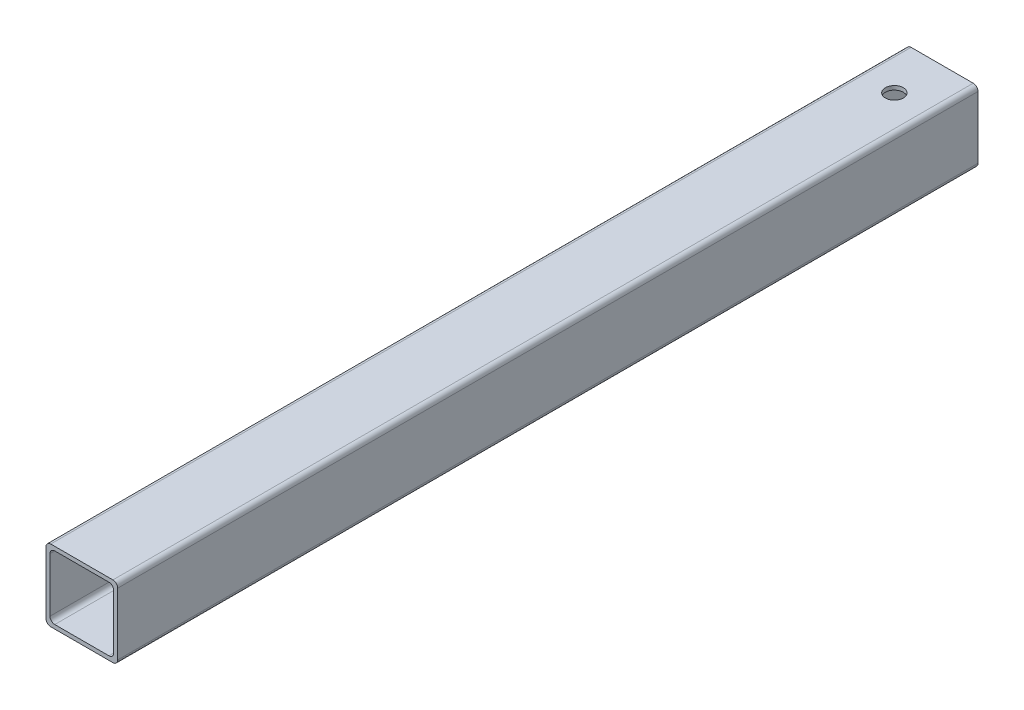
ISO-10303-21;
HEADER;
FILE_DESCRIPTION(('STEP AP214'),'2;1');
FILE_NAME('part.step','',(''),(''),'','','');
FILE_SCHEMA(('AUTOMOTIVE_DESIGN { 1 0 10303 214 1 1 1 1 }'));
ENDSEC;
DATA;
#1=APPLICATION_CONTEXT('core data for automotive mechanical design processes');
#2=APPLICATION_PROTOCOL_DEFINITION('international standard','automotive_design',2000,#1);
#3=PRODUCT_CONTEXT('',#1,'mechanical');
#4=PRODUCT('Part','Part','',(#3));
#5=PRODUCT_RELATED_PRODUCT_CATEGORY('part','',(#4));
#6=PRODUCT_DEFINITION_FORMATION('','',#4);
#7=PRODUCT_DEFINITION_CONTEXT('part definition',#1,'design');
#8=PRODUCT_DEFINITION('design','',#6,#7);
#9=PRODUCT_DEFINITION_SHAPE('','',#8);
#10=(LENGTH_UNIT() NAMED_UNIT(*) SI_UNIT(.MILLI.,.METRE.));
#11=(NAMED_UNIT(*) PLANE_ANGLE_UNIT() SI_UNIT($,.RADIAN.));
#12=(NAMED_UNIT(*) SI_UNIT($,.STERADIAN.) SOLID_ANGLE_UNIT());
#13=UNCERTAINTY_MEASURE_WITH_UNIT(LENGTH_MEASURE(1.E-05),#10,'distance_accuracy_value','');
#14=(GEOMETRIC_REPRESENTATION_CONTEXT(3) GLOBAL_UNCERTAINTY_ASSIGNED_CONTEXT((#13)) GLOBAL_UNIT_ASSIGNED_CONTEXT((#10,
#11,#12)) REPRESENTATION_CONTEXT('',''));
#15=CARTESIAN_POINT('',(0.,0.,0.));
#16=DIRECTION('',(0.,0.,1.));
#17=DIRECTION('',(1.,0.,0.));
#18=AXIS2_PLACEMENT_3D('',#15,#16,#17);
#19=CARTESIAN_POINT('',(0.,0.,457.2));
#20=DIRECTION('',(0.,0.,-1.));
#21=DIRECTION('',(-1.,0.,0.));
#22=AXIS2_PLACEMENT_3D('',#19,#20,#21);
#23=PLANE('',#22);
#24=DIRECTION('',(1.,0.,0.));
#25=VECTOR('',#24,1.);
#26=CARTESIAN_POINT('',(-19.05,-19.05,457.2));
#27=LINE('',#26,#25);
#28=CARTESIAN_POINT('',(-16.51,-19.05,457.2));
#29=VERTEX_POINT('',#28);
#30=CARTESIAN_POINT('',(16.51,-19.05,457.2));
#31=VERTEX_POINT('',#30);
#32=EDGE_CURVE('E191',#29,#31,#27,.T.);
#33=ORIENTED_EDGE('',*,*,#32,.T.);
#34=CARTESIAN_POINT('',(16.51,-16.51,457.2));
#35=DIRECTION('',(0.,0.,-1.));
#36=DIRECTION('',(-1.,0.,0.));
#37=AXIS2_PLACEMENT_3D('',#34,#35,#36);
#38=CIRCLE('',#37,2.54);
#39=CARTESIAN_POINT('',(19.05,-16.51,457.2));
#40=VERTEX_POINT('',#39);
#41=EDGE_CURVE('E212',#31,#40,#38,.F.);
#42=ORIENTED_EDGE('',*,*,#41,.T.);
#43=DIRECTION('',(0.,1.,0.));
#44=VECTOR('',#43,1.);
#45=CARTESIAN_POINT('',(19.05,-19.05,457.2));
#46=LINE('',#45,#44);
#47=CARTESIAN_POINT('',(19.05,16.51,457.2));
#48=VERTEX_POINT('',#47);
#49=EDGE_CURVE('E174',#40,#48,#46,.T.);
#50=ORIENTED_EDGE('',*,*,#49,.T.);
#51=CARTESIAN_POINT('',(16.51,16.51,457.2));
#52=DIRECTION('',(0.,0.,-1.));
#53=DIRECTION('',(-1.,0.,0.));
#54=AXIS2_PLACEMENT_3D('',#51,#52,#53);
#55=CIRCLE('',#54,2.54);
#56=CARTESIAN_POINT('',(16.51,19.05,457.2));
#57=VERTEX_POINT('',#56);
#58=EDGE_CURVE('E210',#48,#57,#55,.F.);
#59=ORIENTED_EDGE('',*,*,#58,.T.);
#60=DIRECTION('',(-1.,0.,0.));
#61=VECTOR('',#60,1.);
#62=CARTESIAN_POINT('',(-19.05,19.05,457.2));
#63=LINE('',#62,#61);
#64=CARTESIAN_POINT('',(-16.51,19.05,457.2));
#65=VERTEX_POINT('',#64);
#66=EDGE_CURVE('E290',#57,#65,#63,.T.);
#67=ORIENTED_EDGE('',*,*,#66,.T.);
#68=CARTESIAN_POINT('',(-16.51,16.51,457.2));
#69=DIRECTION('',(0.,0.,-1.));
#70=DIRECTION('',(-1.,0.,0.));
#71=AXIS2_PLACEMENT_3D('',#68,#69,#70);
#72=CIRCLE('',#71,2.54);
#73=CARTESIAN_POINT('',(-19.05,16.51,457.2));
#74=VERTEX_POINT('',#73);
#75=EDGE_CURVE('E208',#65,#74,#72,.F.);
#76=ORIENTED_EDGE('',*,*,#75,.T.);
#77=DIRECTION('',(0.,-1.,0.));
#78=VECTOR('',#77,1.);
#79=CARTESIAN_POINT('',(-19.05,-19.05,457.2));
#80=LINE('',#79,#78);
#81=CARTESIAN_POINT('',(-19.05,-16.51,457.2));
#82=VERTEX_POINT('',#81);
#83=EDGE_CURVE('E292',#74,#82,#80,.T.);
#84=ORIENTED_EDGE('',*,*,#83,.T.);
#85=CARTESIAN_POINT('',(-16.51,-16.51,457.2));
#86=DIRECTION('',(0.,0.,-1.));
#87=DIRECTION('',(-1.,0.,0.));
#88=AXIS2_PLACEMENT_3D('',#85,#86,#87);
#89=CIRCLE('',#88,2.54);
#90=EDGE_CURVE('E206',#82,#29,#89,.F.);
#91=ORIENTED_EDGE('',*,*,#90,.T.);
#92=EDGE_LOOP('',(#33,#42,#50,#59,#67,#76,#84,#91));
#93=FACE_BOUND('',#92,.T.);
#94=DIRECTION('',(0.,-1.,0.));
#95=VECTOR('',#94,1.);
#96=CARTESIAN_POINT('',(-16.9418,-16.9418,457.2));
#97=LINE('',#96,#95);
#98=CARTESIAN_POINT('',(-16.9418,14.4018,457.2));
#99=VERTEX_POINT('',#98);
#100=CARTESIAN_POINT('',(-16.9418,-14.4018,457.2));
#101=VERTEX_POINT('',#100);
#102=EDGE_CURVE('E270',#99,#101,#97,.T.);
#103=ORIENTED_EDGE('',*,*,#102,.F.);
#104=CARTESIAN_POINT('',(-14.4018,14.4018,457.2));
#105=DIRECTION('',(0.,0.,-1.));
#106=DIRECTION('',(-1.,0.,0.));
#107=AXIS2_PLACEMENT_3D('',#104,#105,#106);
#108=CIRCLE('',#107,2.54);
#109=CARTESIAN_POINT('',(-14.4018,16.9418,457.2));
#110=VERTEX_POINT('',#109);
#111=EDGE_CURVE('E252',#99,#110,#108,.T.);
#112=ORIENTED_EDGE('',*,*,#111,.T.);
#113=DIRECTION('',(-1.,0.,0.));
#114=VECTOR('',#113,1.);
#115=CARTESIAN_POINT('',(-16.9418,16.9418,457.2));
#116=LINE('',#115,#114);
#117=CARTESIAN_POINT('',(14.4018,16.9418,457.2));
#118=VERTEX_POINT('',#117);
#119=EDGE_CURVE('E182',#118,#110,#116,.T.);
#120=ORIENTED_EDGE('',*,*,#119,.F.);
#121=CARTESIAN_POINT('',(14.4018,14.4018,457.2));
#122=DIRECTION('',(0.,0.,-1.));
#123=DIRECTION('',(-1.,0.,0.));
#124=AXIS2_PLACEMENT_3D('',#121,#122,#123);
#125=CIRCLE('',#124,2.54);
#126=CARTESIAN_POINT('',(16.9418,14.4018,457.2));
#127=VERTEX_POINT('',#126);
#128=EDGE_CURVE('E248',#118,#127,#125,.T.);
#129=ORIENTED_EDGE('',*,*,#128,.T.);
#130=DIRECTION('',(0.,1.,0.));
#131=VECTOR('',#130,1.);
#132=CARTESIAN_POINT('',(16.9418,-16.9418,457.2));
#133=LINE('',#132,#131);
#134=CARTESIAN_POINT('',(16.9418,-14.4018,457.2));
#135=VERTEX_POINT('',#134);
#136=EDGE_CURVE('E188',#135,#127,#133,.T.);
#137=ORIENTED_EDGE('',*,*,#136,.F.);
#138=CARTESIAN_POINT('',(14.4018,-14.4018,457.2));
#139=DIRECTION('',(0.,0.,-1.));
#140=DIRECTION('',(-1.,0.,0.));
#141=AXIS2_PLACEMENT_3D('',#138,#139,#140);
#142=CIRCLE('',#141,2.54);
#143=CARTESIAN_POINT('',(14.4018,-16.9418,457.2));
#144=VERTEX_POINT('',#143);
#145=EDGE_CURVE('E55',#135,#144,#142,.T.);
#146=ORIENTED_EDGE('',*,*,#145,.T.);
#147=DIRECTION('',(1.,0.,0.));
#148=VECTOR('',#147,1.);
#149=CARTESIAN_POINT('',(-16.9418,-16.9418,457.2));
#150=LINE('',#149,#148);
#151=CARTESIAN_POINT('',(-14.4018,-16.9418,457.2));
#152=VERTEX_POINT('',#151);
#153=EDGE_CURVE('E272',#152,#144,#150,.T.);
#154=ORIENTED_EDGE('',*,*,#153,.F.);
#155=CARTESIAN_POINT('',(-14.4018,-14.4018,457.2));
#156=DIRECTION('',(0.,0.,-1.));
#157=DIRECTION('',(-1.,0.,0.));
#158=AXIS2_PLACEMENT_3D('',#155,#156,#157);
#159=CIRCLE('',#158,2.54);
#160=EDGE_CURVE('E11',#152,#101,#159,.T.);
#161=ORIENTED_EDGE('',*,*,#160,.T.);
#162=EDGE_LOOP('',(#103,#112,#120,#129,#137,#146,#154,#161));
#163=FACE_BOUND('',#162,.T.);
#164=ADVANCED_FACE('F39',(#93,#163),#23,.F.);
#165=CARTESIAN_POINT('',(0.,0.,0.));
#166=DIRECTION('',(0.,0.,-1.));
#167=DIRECTION('',(-1.,0.,0.));
#168=AXIS2_PLACEMENT_3D('',#165,#166,#167);
#169=PLANE('',#168);
#170=DIRECTION('',(0.,1.,0.));
#171=VECTOR('',#170,1.);
#172=CARTESIAN_POINT('',(19.05,-19.05,0.));
#173=LINE('',#172,#171);
#174=CARTESIAN_POINT('',(19.05,-16.51,0.));
#175=VERTEX_POINT('',#174);
#176=CARTESIAN_POINT('',(19.05,16.51,0.));
#177=VERTEX_POINT('',#176);
#178=EDGE_CURVE('E171',#175,#177,#173,.T.);
#179=ORIENTED_EDGE('',*,*,#178,.F.);
#180=CARTESIAN_POINT('',(16.51,-16.51,0.));
#181=DIRECTION('',(0.,0.,-1.));
#182=DIRECTION('',(-1.,0.,0.));
#183=AXIS2_PLACEMENT_3D('',#180,#181,#182);
#184=CIRCLE('',#183,2.54);
#185=CARTESIAN_POINT('',(16.51,-19.05,0.));
#186=VERTEX_POINT('',#185);
#187=EDGE_CURVE('E154',#175,#186,#184,.T.);
#188=ORIENTED_EDGE('',*,*,#187,.T.);
#189=DIRECTION('',(1.,0.,0.));
#190=VECTOR('',#189,1.);
#191=CARTESIAN_POINT('',(-19.05,-19.05,0.));
#192=LINE('',#191,#190);
#193=CARTESIAN_POINT('',(-16.51,-19.05,0.));
#194=VERTEX_POINT('',#193);
#195=EDGE_CURVE('E196',#194,#186,#192,.T.);
#196=ORIENTED_EDGE('',*,*,#195,.F.);
#197=CARTESIAN_POINT('',(-16.51,-16.51,0.));
#198=DIRECTION('',(0.,0.,-1.));
#199=DIRECTION('',(-1.,0.,0.));
#200=AXIS2_PLACEMENT_3D('',#197,#198,#199);
#201=CIRCLE('',#200,2.54);
#202=CARTESIAN_POINT('',(-19.05,-16.51,0.));
#203=VERTEX_POINT('',#202);
#204=EDGE_CURVE('E175',#194,#203,#201,.T.);
#205=ORIENTED_EDGE('',*,*,#204,.T.);
#206=DIRECTION('',(0.,-1.,0.));
#207=VECTOR('',#206,1.);
#208=CARTESIAN_POINT('',(-19.05,-19.05,0.));
#209=LINE('',#208,#207);
#210=CARTESIAN_POINT('',(-19.05,16.51,0.));
#211=VERTEX_POINT('',#210);
#212=EDGE_CURVE('E185',#211,#203,#209,.T.);
#213=ORIENTED_EDGE('',*,*,#212,.F.);
#214=CARTESIAN_POINT('',(-16.51,16.51,0.));
#215=DIRECTION('',(0.,0.,-1.));
#216=DIRECTION('',(-1.,0.,0.));
#217=AXIS2_PLACEMENT_3D('',#214,#215,#216);
#218=CIRCLE('',#217,2.54);
#219=CARTESIAN_POINT('',(-16.51,19.05,0.));
#220=VERTEX_POINT('',#219);
#221=EDGE_CURVE('E200',#211,#220,#218,.T.);
#222=ORIENTED_EDGE('',*,*,#221,.T.);
#223=DIRECTION('',(-1.,0.,0.));
#224=VECTOR('',#223,1.);
#225=CARTESIAN_POINT('',(-19.05,19.05,0.));
#226=LINE('',#225,#224);
#227=CARTESIAN_POINT('',(16.51,19.05,0.));
#228=VERTEX_POINT('',#227);
#229=EDGE_CURVE('E181',#228,#220,#226,.T.);
#230=ORIENTED_EDGE('',*,*,#229,.F.);
#231=CARTESIAN_POINT('',(16.51,16.51,0.));
#232=DIRECTION('',(0.,0.,-1.));
#233=DIRECTION('',(-1.,0.,0.));
#234=AXIS2_PLACEMENT_3D('',#231,#232,#233);
#235=CIRCLE('',#234,2.54);
#236=EDGE_CURVE('E165',#228,#177,#235,.T.);
#237=ORIENTED_EDGE('',*,*,#236,.T.);
#238=EDGE_LOOP('',(#179,#188,#196,#205,#213,#222,#230,#237));
#239=FACE_BOUND('',#238,.T.);
#240=DIRECTION('',(0.,1.,0.));
#241=VECTOR('',#240,1.);
#242=CARTESIAN_POINT('',(16.9418,-16.9418,0.));
#243=LINE('',#242,#241);
#244=CARTESIAN_POINT('',(16.9418,-14.4018,0.));
#245=VERTEX_POINT('',#244);
#246=CARTESIAN_POINT('',(16.9418,14.4018,0.));
#247=VERTEX_POINT('',#246);
#248=EDGE_CURVE('E264',#245,#247,#243,.T.);
#249=ORIENTED_EDGE('',*,*,#248,.T.);
#250=CARTESIAN_POINT('',(14.4018,14.4018,0.));
#251=DIRECTION('',(0.,0.,-1.));
#252=DIRECTION('',(-1.,0.,0.));
#253=AXIS2_PLACEMENT_3D('',#250,#251,#252);
#254=CIRCLE('',#253,2.54);
#255=CARTESIAN_POINT('',(14.4018,16.9418,0.));
#256=VERTEX_POINT('',#255);
#257=EDGE_CURVE('E246',#247,#256,#254,.F.);
#258=ORIENTED_EDGE('',*,*,#257,.T.);
#259=DIRECTION('',(-1.,0.,0.));
#260=VECTOR('',#259,1.);
#261=CARTESIAN_POINT('',(-16.9418,16.9418,0.));
#262=LINE('',#261,#260);
#263=CARTESIAN_POINT('',(-14.4018,16.9418,0.));
#264=VERTEX_POINT('',#263);
#265=EDGE_CURVE('E276',#256,#264,#262,.T.);
#266=ORIENTED_EDGE('',*,*,#265,.T.);
#267=CARTESIAN_POINT('',(-14.4018,14.4018,0.));
#268=DIRECTION('',(0.,0.,-1.));
#269=DIRECTION('',(-1.,0.,0.));
#270=AXIS2_PLACEMENT_3D('',#267,#268,#269);
#271=CIRCLE('',#270,2.54);
#272=CARTESIAN_POINT('',(-16.9418,14.4018,0.));
#273=VERTEX_POINT('',#272);
#274=EDGE_CURVE('E250',#264,#273,#271,.F.);
#275=ORIENTED_EDGE('',*,*,#274,.T.);
#276=DIRECTION('',(0.,-1.,0.));
#277=VECTOR('',#276,1.);
#278=CARTESIAN_POINT('',(-16.9418,-16.9418,0.));
#279=LINE('',#278,#277);
#280=CARTESIAN_POINT('',(-16.9418,-14.4018,0.));
#281=VERTEX_POINT('',#280);
#282=EDGE_CURVE('E259',#273,#281,#279,.T.);
#283=ORIENTED_EDGE('',*,*,#282,.T.);
#284=CARTESIAN_POINT('',(-14.4018,-14.4018,0.));
#285=DIRECTION('',(0.,0.,-1.));
#286=DIRECTION('',(-1.,0.,0.));
#287=AXIS2_PLACEMENT_3D('',#284,#285,#286);
#288=CIRCLE('',#287,2.54);
#289=CARTESIAN_POINT('',(-14.4018,-16.9418,0.));
#290=VERTEX_POINT('',#289);
#291=EDGE_CURVE('E48',#281,#290,#288,.F.);
#292=ORIENTED_EDGE('',*,*,#291,.T.);
#293=DIRECTION('',(1.,0.,0.));
#294=VECTOR('',#293,1.);
#295=CARTESIAN_POINT('',(-16.9418,-16.9418,0.));
#296=LINE('',#295,#294);
#297=CARTESIAN_POINT('',(14.4018,-16.9418,0.));
#298=VERTEX_POINT('',#297);
#299=EDGE_CURVE('E257',#290,#298,#296,.T.);
#300=ORIENTED_EDGE('',*,*,#299,.T.);
#301=CARTESIAN_POINT('',(14.4018,-14.4018,0.));
#302=DIRECTION('',(0.,0.,-1.));
#303=DIRECTION('',(-1.,0.,0.));
#304=AXIS2_PLACEMENT_3D('',#301,#302,#303);
#305=CIRCLE('',#304,2.54);
#306=EDGE_CURVE('E243',#298,#245,#305,.F.);
#307=ORIENTED_EDGE('',*,*,#306,.T.);
#308=EDGE_LOOP('',(#249,#258,#266,#275,#283,#292,#300,#307));
#309=FACE_BOUND('',#308,.T.);
#310=ADVANCED_FACE('F178',(#239,#309),#169,.T.);
#311=CARTESIAN_POINT('',(19.05,-19.05,457.2));
#312=DIRECTION('',(-1.,0.,0.));
#313=DIRECTION('',(0.,0.,1.));
#314=AXIS2_PLACEMENT_3D('',#311,#312,#313);
#315=PLANE('',#314);
#316=ORIENTED_EDGE('',*,*,#49,.F.);
#317=DIRECTION('',(0.,0.,-1.));
#318=VECTOR('',#317,1.);
#319=CARTESIAN_POINT('',(19.05,-16.51,457.2));
#320=LINE('',#319,#318);
#321=EDGE_CURVE('E158',#40,#175,#320,.T.);
#322=ORIENTED_EDGE('',*,*,#321,.T.);
#323=ORIENTED_EDGE('',*,*,#178,.T.);
#324=DIRECTION('',(0.,0.,-1.));
#325=VECTOR('',#324,1.);
#326=CARTESIAN_POINT('',(19.05,16.51,457.2));
#327=LINE('',#326,#325);
#328=EDGE_CURVE('E176',#177,#48,#327,.F.);
#329=ORIENTED_EDGE('',*,*,#328,.T.);
#330=EDGE_LOOP('',(#316,#322,#323,#329));
#331=FACE_BOUND('',#330,.T.);
#332=ADVANCED_FACE('F170',(#331),#315,.F.);
#333=CARTESIAN_POINT('',(-19.05,19.05,457.2));
#334=DIRECTION('',(0.,-1.,0.));
#335=DIRECTION('',(0.,0.,-1.));
#336=AXIS2_PLACEMENT_3D('',#333,#334,#335);
#337=PLANE('',#336);
#338=CARTESIAN_POINT('',(0.,19.05,25.4));
#339=DIRECTION('',(0.,1.,0.));
#340=DIRECTION('',(0.,0.,1.));
#341=AXIS2_PLACEMENT_3D('',#338,#339,#340);
#342=CIRCLE('',#341,4.7625);
#343=CARTESIAN_POINT('',(0.,19.05,30.1625));
#344=VERTEX_POINT('',#343);
#345=EDGE_CURVE('E392',#344,#344,#342,.T.);
#346=ORIENTED_EDGE('',*,*,#345,.F.);
#347=EDGE_LOOP('',(#346));
#348=FACE_BOUND('',#347,.T.);
#349=ORIENTED_EDGE('',*,*,#66,.F.);
#350=DIRECTION('',(0.,0.,-1.));
#351=VECTOR('',#350,1.);
#352=CARTESIAN_POINT('',(16.51,19.05,457.2));
#353=LINE('',#352,#351);
#354=EDGE_CURVE('E230',#57,#228,#353,.T.);
#355=ORIENTED_EDGE('',*,*,#354,.T.);
#356=ORIENTED_EDGE('',*,*,#229,.T.);
#357=DIRECTION('',(0.,0.,-1.));
#358=VECTOR('',#357,1.);
#359=CARTESIAN_POINT('',(-16.51,19.05,457.2));
#360=LINE('',#359,#358);
#361=EDGE_CURVE('E228',#220,#65,#360,.F.);
#362=ORIENTED_EDGE('',*,*,#361,.T.);
#363=EDGE_LOOP('',(#349,#355,#356,#362));
#364=FACE_BOUND('',#363,.T.);
#365=ADVANCED_FACE('F314',(#348,#364),#337,.F.);
#366=CARTESIAN_POINT('',(-19.05,-19.05,457.2));
#367=DIRECTION('',(1.,0.,0.));
#368=DIRECTION('',(0.,0.,-1.));
#369=AXIS2_PLACEMENT_3D('',#366,#367,#368);
#370=PLANE('',#369);
#371=ORIENTED_EDGE('',*,*,#83,.F.);
#372=DIRECTION('',(0.,0.,-1.));
#373=VECTOR('',#372,1.);
#374=CARTESIAN_POINT('',(-19.05,16.51,457.2));
#375=LINE('',#374,#373);
#376=EDGE_CURVE('E240',#74,#211,#375,.T.);
#377=ORIENTED_EDGE('',*,*,#376,.T.);
#378=ORIENTED_EDGE('',*,*,#212,.T.);
#379=DIRECTION('',(0.,0.,-1.));
#380=VECTOR('',#379,1.);
#381=CARTESIAN_POINT('',(-19.05,-16.51,457.2));
#382=LINE('',#381,#380);
#383=EDGE_CURVE('E238',#203,#82,#382,.F.);
#384=ORIENTED_EDGE('',*,*,#383,.T.);
#385=EDGE_LOOP('',(#371,#377,#378,#384));
#386=FACE_BOUND('',#385,.T.);
#387=ADVANCED_FACE('F306',(#386),#370,.F.);
#388=CARTESIAN_POINT('',(-19.05,-19.05,457.2));
#389=DIRECTION('',(0.,1.,0.));
#390=DIRECTION('',(0.,0.,1.));
#391=AXIS2_PLACEMENT_3D('',#388,#389,#390);
#392=PLANE('',#391);
#393=CARTESIAN_POINT('',(0.,-19.05,25.4));
#394=DIRECTION('',(0.,1.,0.));
#395=DIRECTION('',(0.,0.,1.));
#396=AXIS2_PLACEMENT_3D('',#393,#394,#395);
#397=CIRCLE('',#396,4.7625);
#398=CARTESIAN_POINT('',(0.,-19.05,30.1625));
#399=VERTEX_POINT('',#398);
#400=EDGE_CURVE('E389',#399,#399,#397,.T.);
#401=ORIENTED_EDGE('',*,*,#400,.T.);
#402=EDGE_LOOP('',(#401));
#403=FACE_BOUND('',#402,.T.);
#404=ORIENTED_EDGE('',*,*,#195,.T.);
#405=DIRECTION('',(0.,0.,-1.));
#406=VECTOR('',#405,1.);
#407=CARTESIAN_POINT('',(16.51,-19.05,457.2));
#408=LINE('',#407,#406);
#409=EDGE_CURVE('E159',#186,#31,#408,.F.);
#410=ORIENTED_EDGE('',*,*,#409,.T.);
#411=ORIENTED_EDGE('',*,*,#32,.F.);
#412=DIRECTION('',(0.,0.,-1.));
#413=VECTOR('',#412,1.);
#414=CARTESIAN_POINT('',(-16.51,-19.05,457.2));
#415=LINE('',#414,#413);
#416=EDGE_CURVE('E164',#29,#194,#415,.T.);
#417=ORIENTED_EDGE('',*,*,#416,.T.);
#418=EDGE_LOOP('',(#404,#410,#411,#417));
#419=FACE_BOUND('',#418,.T.);
#420=ADVANCED_FACE('F301',(#403,#419),#392,.F.);
#421=CARTESIAN_POINT('',(-16.9418,-16.9418,457.2));
#422=DIRECTION('',(1.,0.,0.));
#423=DIRECTION('',(0.,0.,-1.));
#424=AXIS2_PLACEMENT_3D('',#421,#422,#423);
#425=PLANE('',#424);
#426=ORIENTED_EDGE('',*,*,#282,.F.);
#427=DIRECTION('',(0.,0.,-1.));
#428=VECTOR('',#427,1.);
#429=CARTESIAN_POINT('',(-16.9418,14.4018,457.2));
#430=LINE('',#429,#428);
#431=EDGE_CURVE('E236',#273,#99,#430,.F.);
#432=ORIENTED_EDGE('',*,*,#431,.T.);
#433=ORIENTED_EDGE('',*,*,#102,.T.);
#434=DIRECTION('',(0.,0.,-1.));
#435=VECTOR('',#434,1.);
#436=CARTESIAN_POINT('',(-16.9418,-14.4018,0.));
#437=LINE('',#436,#435);
#438=EDGE_CURVE('E233',#101,#281,#437,.T.);
#439=ORIENTED_EDGE('',*,*,#438,.T.);
#440=EDGE_LOOP('',(#426,#432,#433,#439));
#441=FACE_BOUND('',#440,.T.);
#442=ADVANCED_FACE('F274',(#441),#425,.T.);
#443=CARTESIAN_POINT('',(-16.9418,-16.9418,457.2));
#444=DIRECTION('',(0.,1.,0.));
#445=DIRECTION('',(0.,0.,1.));
#446=AXIS2_PLACEMENT_3D('',#443,#444,#445);
#447=PLANE('',#446);
#448=CARTESIAN_POINT('',(0.,-16.9418,25.4));
#449=DIRECTION('',(0.,1.,0.));
#450=DIRECTION('',(0.,0.,1.));
#451=AXIS2_PLACEMENT_3D('',#448,#449,#450);
#452=CIRCLE('',#451,4.7625);
#453=CARTESIAN_POINT('',(0.,-16.9418,30.1625));
#454=VERTEX_POINT('',#453);
#455=EDGE_CURVE('E282',#454,#454,#452,.T.);
#456=ORIENTED_EDGE('',*,*,#455,.F.);
#457=EDGE_LOOP('',(#456));
#458=FACE_BOUND('',#457,.T.);
#459=ORIENTED_EDGE('',*,*,#153,.T.);
#460=DIRECTION('',(0.,0.,-1.));
#461=VECTOR('',#460,1.);
#462=CARTESIAN_POINT('',(14.4018,-16.9418,0.));
#463=LINE('',#462,#461);
#464=EDGE_CURVE('E215',#144,#298,#463,.T.);
#465=ORIENTED_EDGE('',*,*,#464,.T.);
#466=ORIENTED_EDGE('',*,*,#299,.F.);
#467=DIRECTION('',(0.,0.,-1.));
#468=VECTOR('',#467,1.);
#469=CARTESIAN_POINT('',(-14.4018,-16.9418,457.2));
#470=LINE('',#469,#468);
#471=EDGE_CURVE('E62',#290,#152,#470,.F.);
#472=ORIENTED_EDGE('',*,*,#471,.T.);
#473=EDGE_LOOP('',(#459,#465,#466,#472));
#474=FACE_BOUND('',#473,.T.);
#475=ADVANCED_FACE('F262',(#458,#474),#447,.T.);
#476=CARTESIAN_POINT('',(16.9418,-16.9418,457.2));
#477=DIRECTION('',(-1.,0.,0.));
#478=DIRECTION('',(0.,-1.,0.));
#479=AXIS2_PLACEMENT_3D('',#476,#477,#478);
#480=PLANE('',#479);
#481=ORIENTED_EDGE('',*,*,#248,.F.);
#482=DIRECTION('',(0.,0.,-1.));
#483=VECTOR('',#482,1.);
#484=CARTESIAN_POINT('',(16.9418,-14.4018,457.2));
#485=LINE('',#484,#483);
#486=EDGE_CURVE('E221',#245,#135,#485,.F.);
#487=ORIENTED_EDGE('',*,*,#486,.T.);
#488=ORIENTED_EDGE('',*,*,#136,.T.);
#489=DIRECTION('',(0.,0.,-1.));
#490=VECTOR('',#489,1.);
#491=CARTESIAN_POINT('',(16.9418,14.4018,0.));
#492=LINE('',#491,#490);
#493=EDGE_CURVE('E218',#127,#247,#492,.T.);
#494=ORIENTED_EDGE('',*,*,#493,.T.);
#495=EDGE_LOOP('',(#481,#487,#488,#494));
#496=FACE_BOUND('',#495,.T.);
#497=ADVANCED_FACE('F361',(#496),#480,.T.);
#498=CARTESIAN_POINT('',(-16.9418,16.9418,457.2));
#499=DIRECTION('',(0.,-1.,0.));
#500=DIRECTION('',(1.,0.,0.));
#501=AXIS2_PLACEMENT_3D('',#498,#499,#500);
#502=PLANE('',#501);
#503=CARTESIAN_POINT('',(0.,16.9418,25.4));
#504=DIRECTION('',(0.,-1.,0.));
#505=DIRECTION('',(1.,0.,0.));
#506=AXIS2_PLACEMENT_3D('',#503,#504,#505);
#507=CIRCLE('',#506,4.7625);
#508=CARTESIAN_POINT('',(0.,16.9418,30.1625));
#509=VERTEX_POINT('',#508);
#510=EDGE_CURVE('E43',#509,#509,#507,.T.);
#511=ORIENTED_EDGE('',*,*,#510,.F.);
#512=EDGE_LOOP('',(#511));
#513=FACE_BOUND('',#512,.T.);
#514=ORIENTED_EDGE('',*,*,#265,.F.);
#515=DIRECTION('',(0.,0.,-1.));
#516=VECTOR('',#515,1.);
#517=CARTESIAN_POINT('',(14.4018,16.9418,457.2));
#518=LINE('',#517,#516);
#519=EDGE_CURVE('E226',#256,#118,#518,.F.);
#520=ORIENTED_EDGE('',*,*,#519,.T.);
#521=ORIENTED_EDGE('',*,*,#119,.T.);
#522=DIRECTION('',(0.,0.,-1.));
#523=VECTOR('',#522,1.);
#524=CARTESIAN_POINT('',(-14.4018,16.9418,0.));
#525=LINE('',#524,#523);
#526=EDGE_CURVE('E223',#110,#264,#525,.T.);
#527=ORIENTED_EDGE('',*,*,#526,.T.);
#528=EDGE_LOOP('',(#514,#520,#521,#527));
#529=FACE_BOUND('',#528,.T.);
#530=ADVANCED_FACE('F353',(#513,#529),#502,.T.);
#531=CARTESIAN_POINT('',(16.51,-16.51,457.2));
#532=DIRECTION('',(0.,0.,-1.));
#533=DIRECTION('',(-1.,0.,0.));
#534=AXIS2_PLACEMENT_3D('',#531,#532,#533);
#535=CYLINDRICAL_SURFACE('',#534,2.54);
#536=ORIENTED_EDGE('',*,*,#41,.F.);
#537=ORIENTED_EDGE('',*,*,#409,.F.);
#538=ORIENTED_EDGE('',*,*,#187,.F.);
#539=ORIENTED_EDGE('',*,*,#321,.F.);
#540=EDGE_LOOP('',(#536,#537,#538,#539));
#541=FACE_BOUND('',#540,.T.);
#542=ADVANCED_FACE('F157',(#541),#535,.T.);
#543=CARTESIAN_POINT('',(14.4018,-14.4018,457.2));
#544=DIRECTION('',(0.,0.,1.));
#545=DIRECTION('',(1.,0.,0.));
#546=AXIS2_PLACEMENT_3D('',#543,#544,#545);
#547=CYLINDRICAL_SURFACE('',#546,2.54);
#548=ORIENTED_EDGE('',*,*,#145,.F.);
#549=ORIENTED_EDGE('',*,*,#486,.F.);
#550=ORIENTED_EDGE('',*,*,#306,.F.);
#551=ORIENTED_EDGE('',*,*,#464,.F.);
#552=EDGE_LOOP('',(#548,#549,#550,#551));
#553=FACE_BOUND('',#552,.T.);
#554=ADVANCED_FACE('F329',(#553),#547,.F.);
#555=CARTESIAN_POINT('',(14.4018,14.4018,457.2));
#556=DIRECTION('',(0.,0.,1.));
#557=DIRECTION('',(1.,0.,0.));
#558=AXIS2_PLACEMENT_3D('',#555,#556,#557);
#559=CYLINDRICAL_SURFACE('',#558,2.54);
#560=ORIENTED_EDGE('',*,*,#128,.F.);
#561=ORIENTED_EDGE('',*,*,#519,.F.);
#562=ORIENTED_EDGE('',*,*,#257,.F.);
#563=ORIENTED_EDGE('',*,*,#493,.F.);
#564=EDGE_LOOP('',(#560,#561,#562,#563));
#565=FACE_BOUND('',#564,.T.);
#566=ADVANCED_FACE('F321',(#565),#559,.F.);
#567=CARTESIAN_POINT('',(16.51,16.51,457.2));
#568=DIRECTION('',(0.,0.,-1.));
#569=DIRECTION('',(-1.,0.,0.));
#570=AXIS2_PLACEMENT_3D('',#567,#568,#569);
#571=CYLINDRICAL_SURFACE('',#570,2.54);
#572=ORIENTED_EDGE('',*,*,#58,.F.);
#573=ORIENTED_EDGE('',*,*,#328,.F.);
#574=ORIENTED_EDGE('',*,*,#236,.F.);
#575=ORIENTED_EDGE('',*,*,#354,.F.);
#576=EDGE_LOOP('',(#572,#573,#574,#575));
#577=FACE_BOUND('',#576,.T.);
#578=ADVANCED_FACE('F318',(#577),#571,.T.);
#579=CARTESIAN_POINT('',(-14.4018,14.4018,457.2));
#580=DIRECTION('',(0.,0.,1.));
#581=DIRECTION('',(1.,0.,0.));
#582=AXIS2_PLACEMENT_3D('',#579,#580,#581);
#583=CYLINDRICAL_SURFACE('',#582,2.54);
#584=ORIENTED_EDGE('',*,*,#111,.F.);
#585=ORIENTED_EDGE('',*,*,#431,.F.);
#586=ORIENTED_EDGE('',*,*,#274,.F.);
#587=ORIENTED_EDGE('',*,*,#526,.F.);
#588=EDGE_LOOP('',(#584,#585,#586,#587));
#589=FACE_BOUND('',#588,.T.);
#590=ADVANCED_FACE('F320',(#589),#583,.F.);
#591=CARTESIAN_POINT('',(-16.51,16.51,457.2));
#592=DIRECTION('',(0.,0.,-1.));
#593=DIRECTION('',(-1.,0.,0.));
#594=AXIS2_PLACEMENT_3D('',#591,#592,#593);
#595=CYLINDRICAL_SURFACE('',#594,2.54);
#596=ORIENTED_EDGE('',*,*,#75,.F.);
#597=ORIENTED_EDGE('',*,*,#361,.F.);
#598=ORIENTED_EDGE('',*,*,#221,.F.);
#599=ORIENTED_EDGE('',*,*,#376,.F.);
#600=EDGE_LOOP('',(#596,#597,#598,#599));
#601=FACE_BOUND('',#600,.T.);
#602=ADVANCED_FACE('F310',(#601),#595,.T.);
#603=CARTESIAN_POINT('',(-14.4018,-14.4018,457.2));
#604=DIRECTION('',(0.,0.,1.));
#605=DIRECTION('',(1.,0.,0.));
#606=AXIS2_PLACEMENT_3D('',#603,#604,#605);
#607=CYLINDRICAL_SURFACE('',#606,2.54);
#608=ORIENTED_EDGE('',*,*,#160,.F.);
#609=ORIENTED_EDGE('',*,*,#471,.F.);
#610=ORIENTED_EDGE('',*,*,#291,.F.);
#611=ORIENTED_EDGE('',*,*,#438,.F.);
#612=EDGE_LOOP('',(#608,#609,#610,#611));
#613=FACE_BOUND('',#612,.T.);
#614=ADVANCED_FACE('F267',(#613),#607,.F.);
#615=CARTESIAN_POINT('',(-16.51,-16.51,457.2));
#616=DIRECTION('',(0.,0.,-1.));
#617=DIRECTION('',(-1.,0.,0.));
#618=AXIS2_PLACEMENT_3D('',#615,#616,#617);
#619=CYLINDRICAL_SURFACE('',#618,2.54);
#620=ORIENTED_EDGE('',*,*,#90,.F.);
#621=ORIENTED_EDGE('',*,*,#383,.F.);
#622=ORIENTED_EDGE('',*,*,#204,.F.);
#623=ORIENTED_EDGE('',*,*,#416,.F.);
#624=EDGE_LOOP('',(#620,#621,#622,#623));
#625=FACE_BOUND('',#624,.T.);
#626=ADVANCED_FACE('F41',(#625),#619,.T.);
#627=CARTESIAN_POINT('',(0.,-19.05,25.4));
#628=DIRECTION('',(0.,1.,0.));
#629=DIRECTION('',(0.,0.,1.));
#630=AXIS2_PLACEMENT_3D('',#627,#628,#629);
#631=CYLINDRICAL_SURFACE('',#630,4.7625);
#632=CARTESIAN_POINT('',(0.,16.9418,30.1625));
#633=CARTESIAN_POINT('',(0.,16.9637604166667,30.1625));
#634=CARTESIAN_POINT('',(0.,16.9857208333333,30.1625));
#635=CARTESIAN_POINT('',(0.,17.0296416666667,30.1625));
#636=CARTESIAN_POINT('',(0.,17.0516020833333,30.1625));
#637=CARTESIAN_POINT('',(0.,17.0955229166667,30.1625));
#638=CARTESIAN_POINT('',(0.,17.1174833333333,30.1625));
#639=CARTESIAN_POINT('',(0.,17.1614041666667,30.1625));
#640=CARTESIAN_POINT('',(0.,17.1833645833333,30.1625));
#641=CARTESIAN_POINT('',(0.,17.2272854166667,30.1625));
#642=CARTESIAN_POINT('',(0.,17.2492458333333,30.1625));
#643=CARTESIAN_POINT('',(0.,17.2931666666667,30.1625));
#644=CARTESIAN_POINT('',(0.,17.3151270833333,30.1625));
#645=CARTESIAN_POINT('',(0.,17.3590479166667,30.1625));
#646=CARTESIAN_POINT('',(0.,17.3810083333333,30.1625));
#647=CARTESIAN_POINT('',(0.,17.4249291666667,30.1625));
#648=CARTESIAN_POINT('',(0.,17.4468895833333,30.1625));
#649=CARTESIAN_POINT('',(0.,17.4908104166667,30.1625));
#650=CARTESIAN_POINT('',(0.,17.5127708333333,30.1625));
#651=CARTESIAN_POINT('',(0.,17.5566916666667,30.1625));
#652=CARTESIAN_POINT('',(0.,17.5786520833333,30.1625));
#653=CARTESIAN_POINT('',(0.,17.6225729166667,30.1625));
#654=CARTESIAN_POINT('',(0.,17.6445333333333,30.1625));
#655=CARTESIAN_POINT('',(0.,17.6884541666667,30.1625));
#656=CARTESIAN_POINT('',(0.,17.7104145833333,30.1625));
#657=CARTESIAN_POINT('',(0.,17.7543354166667,30.1625));
#658=CARTESIAN_POINT('',(0.,17.7762958333333,30.1625));
#659=CARTESIAN_POINT('',(0.,17.8202166666667,30.1625));
#660=CARTESIAN_POINT('',(0.,17.8421770833333,30.1625));
#661=CARTESIAN_POINT('',(0.,17.8860979166667,30.1625));
#662=CARTESIAN_POINT('',(0.,17.9080583333333,30.1625));
#663=CARTESIAN_POINT('',(0.,17.9519791666667,30.1625));
#664=CARTESIAN_POINT('',(0.,17.9739395833333,30.1625));
#665=CARTESIAN_POINT('',(0.,18.0178604166667,30.1625));
#666=CARTESIAN_POINT('',(0.,18.0398208333333,30.1625));
#667=CARTESIAN_POINT('',(0.,18.0837416666667,30.1625));
#668=CARTESIAN_POINT('',(0.,18.1057020833333,30.1625));
#669=CARTESIAN_POINT('',(0.,18.1496229166667,30.1625));
#670=CARTESIAN_POINT('',(0.,18.1715833333333,30.1625));
#671=CARTESIAN_POINT('',(0.,18.2155041666667,30.1625));
#672=CARTESIAN_POINT('',(0.,18.2374645833333,30.1625));
#673=CARTESIAN_POINT('',(0.,18.2813854166667,30.1625));
#674=CARTESIAN_POINT('',(0.,18.3033458333333,30.1625));
#675=CARTESIAN_POINT('',(0.,18.3472666666667,30.1625));
#676=CARTESIAN_POINT('',(0.,18.3692270833333,30.1625));
#677=CARTESIAN_POINT('',(0.,18.4131479166667,30.1625));
#678=CARTESIAN_POINT('',(0.,18.4351083333333,30.1625));
#679=CARTESIAN_POINT('',(0.,18.4790291666667,30.1625));
#680=CARTESIAN_POINT('',(0.,18.5009895833333,30.1625));
#681=CARTESIAN_POINT('',(0.,18.5449104166667,30.1625));
#682=CARTESIAN_POINT('',(0.,18.5668708333333,30.1625));
#683=CARTESIAN_POINT('',(0.,18.6107916666667,30.1625));
#684=CARTESIAN_POINT('',(0.,18.6327520833333,30.1625));
#685=CARTESIAN_POINT('',(0.,18.6766729166667,30.1625));
#686=CARTESIAN_POINT('',(0.,18.6986333333333,30.1625));
#687=CARTESIAN_POINT('',(0.,18.7425541666667,30.1625));
#688=CARTESIAN_POINT('',(0.,18.7645145833333,30.1625));
#689=CARTESIAN_POINT('',(0.,18.8084354166667,30.1625));
#690=CARTESIAN_POINT('',(0.,18.8303958333333,30.1625));
#691=CARTESIAN_POINT('',(0.,18.8743166666667,30.1625));
#692=CARTESIAN_POINT('',(0.,18.8962770833333,30.1625));
#693=CARTESIAN_POINT('',(0.,18.9401979166667,30.1625));
#694=CARTESIAN_POINT('',(0.,18.9621583333333,30.1625));
#695=CARTESIAN_POINT('',(0.,19.0060791666667,30.1625));
#696=CARTESIAN_POINT('',(0.,19.0280395833333,30.1625));
#697=CARTESIAN_POINT('',(0.,19.05,30.1625));
#698=B_SPLINE_CURVE_WITH_KNOTS('',3,(#632,#633,#634,#635,#636,#637,#638,#639,#640,#641,#642,
#643,#644,#645,#646,#647,#648,#649,#650,#651,#652,#653,#654,#655,#656,#657,#658,#659,#660,#661,
#662,#663,#664,#665,#666,#667,#668,#669,#670,#671,#672,#673,#674,#675,#676,#677,#678,#679,#680,
#681,#682,#683,#684,#685,#686,#687,#688,#689,#690,#691,#692,#693,#694,#695,#696,#697),
.UNSPECIFIED.,.F.,.F.,(4,2,2,2,2,2,2,2,2,2,2,2,2,2,2,2,2,2,2,2,2,2,2,2,2,2,2,2,2,2,2,2,4),(0.,
0.0658812499999967,0.1317625,0.197643749999997,0.263525000000001,0.329406249999997,
0.395287500000001,0.461168749999998,0.527050000000001,0.592931249999998,0.658812499999994,
0.724693749999998,0.790574999999995,0.856456249999998,0.922337499999995,0.988218749999999,
1.0541,1.11998124999999,1.1858625,1.25174374999999,1.317625,1.38350624999999,1.4493875,
1.51526874999999,1.58114999999999,1.64703124999999,1.71291249999999,1.77879374999999,
1.84467499999999,1.91055624999999,1.97643749999999,2.04231874999999,2.10819999999999),.UNSPECIFIED.);
#699=EDGE_CURVE('BSEAM380',#509,#344,#698,.T.);
#700=ORIENTED_EDGE('',*,*,#510,.T.);
#701=ORIENTED_EDGE('',*,*,#345,.T.);
#702=ORIENTED_EDGE('',*,*,#699,.T.);
#703=ORIENTED_EDGE('',*,*,#699,.F.);
#704=EDGE_LOOP('',(#700,#702,#701,#703));
#705=FACE_BOUND('',#704,.T.);
#706=ADVANCED_FACE('F380',(#705),#631,.F.);
#707=CARTESIAN_POINT('',(0.,-16.9418,30.1625));
#708=CARTESIAN_POINT('',(0.,-16.9637604166667,30.1625));
#709=CARTESIAN_POINT('',(0.,-16.9857208333333,30.1625));
#710=CARTESIAN_POINT('',(0.,-17.0296416666667,30.1625));
#711=CARTESIAN_POINT('',(0.,-17.0516020833333,30.1625));
#712=CARTESIAN_POINT('',(0.,-17.0955229166667,30.1625));
#713=CARTESIAN_POINT('',(0.,-17.1174833333333,30.1625));
#714=CARTESIAN_POINT('',(0.,-17.1614041666667,30.1625));
#715=CARTESIAN_POINT('',(0.,-17.1833645833333,30.1625));
#716=CARTESIAN_POINT('',(0.,-17.2272854166667,30.1625));
#717=CARTESIAN_POINT('',(0.,-17.2492458333333,30.1625));
#718=CARTESIAN_POINT('',(0.,-17.2931666666667,30.1625));
#719=CARTESIAN_POINT('',(0.,-17.3151270833333,30.1625));
#720=CARTESIAN_POINT('',(0.,-17.3590479166667,30.1625));
#721=CARTESIAN_POINT('',(0.,-17.3810083333333,30.1625));
#722=CARTESIAN_POINT('',(0.,-17.4249291666667,30.1625));
#723=CARTESIAN_POINT('',(0.,-17.4468895833333,30.1625));
#724=CARTESIAN_POINT('',(0.,-17.4908104166667,30.1625));
#725=CARTESIAN_POINT('',(0.,-17.5127708333333,30.1625));
#726=CARTESIAN_POINT('',(0.,-17.5566916666667,30.1625));
#727=CARTESIAN_POINT('',(0.,-17.5786520833333,30.1625));
#728=CARTESIAN_POINT('',(0.,-17.6225729166667,30.1625));
#729=CARTESIAN_POINT('',(0.,-17.6445333333333,30.1625));
#730=CARTESIAN_POINT('',(0.,-17.6884541666667,30.1625));
#731=CARTESIAN_POINT('',(0.,-17.7104145833333,30.1625));
#732=CARTESIAN_POINT('',(0.,-17.7543354166667,30.1625));
#733=CARTESIAN_POINT('',(0.,-17.7762958333333,30.1625));
#734=CARTESIAN_POINT('',(0.,-17.8202166666667,30.1625));
#735=CARTESIAN_POINT('',(0.,-17.8421770833333,30.1625));
#736=CARTESIAN_POINT('',(0.,-17.8860979166667,30.1625));
#737=CARTESIAN_POINT('',(0.,-17.9080583333333,30.1625));
#738=CARTESIAN_POINT('',(0.,-17.9519791666667,30.1625));
#739=CARTESIAN_POINT('',(0.,-17.9739395833333,30.1625));
#740=CARTESIAN_POINT('',(0.,-18.0178604166667,30.1625));
#741=CARTESIAN_POINT('',(0.,-18.0398208333333,30.1625));
#742=CARTESIAN_POINT('',(0.,-18.0837416666667,30.1625));
#743=CARTESIAN_POINT('',(0.,-18.1057020833333,30.1625));
#744=CARTESIAN_POINT('',(0.,-18.1496229166667,30.1625));
#745=CARTESIAN_POINT('',(0.,-18.1715833333333,30.1625));
#746=CARTESIAN_POINT('',(0.,-18.2155041666667,30.1625));
#747=CARTESIAN_POINT('',(0.,-18.2374645833333,30.1625));
#748=CARTESIAN_POINT('',(0.,-18.2813854166667,30.1625));
#749=CARTESIAN_POINT('',(0.,-18.3033458333333,30.1625));
#750=CARTESIAN_POINT('',(0.,-18.3472666666667,30.1625));
#751=CARTESIAN_POINT('',(0.,-18.3692270833333,30.1625));
#752=CARTESIAN_POINT('',(0.,-18.4131479166667,30.1625));
#753=CARTESIAN_POINT('',(0.,-18.4351083333333,30.1625));
#754=CARTESIAN_POINT('',(0.,-18.4790291666667,30.1625));
#755=CARTESIAN_POINT('',(0.,-18.5009895833333,30.1625));
#756=CARTESIAN_POINT('',(0.,-18.5449104166667,30.1625));
#757=CARTESIAN_POINT('',(0.,-18.5668708333333,30.1625));
#758=CARTESIAN_POINT('',(0.,-18.6107916666667,30.1625));
#759=CARTESIAN_POINT('',(0.,-18.6327520833333,30.1625));
#760=CARTESIAN_POINT('',(0.,-18.6766729166667,30.1625));
#761=CARTESIAN_POINT('',(0.,-18.6986333333333,30.1625));
#762=CARTESIAN_POINT('',(0.,-18.7425541666667,30.1625));
#763=CARTESIAN_POINT('',(0.,-18.7645145833333,30.1625));
#764=CARTESIAN_POINT('',(0.,-18.8084354166667,30.1625));
#765=CARTESIAN_POINT('',(0.,-18.8303958333333,30.1625));
#766=CARTESIAN_POINT('',(0.,-18.8743166666667,30.1625));
#767=CARTESIAN_POINT('',(0.,-18.8962770833333,30.1625));
#768=CARTESIAN_POINT('',(0.,-18.9401979166667,30.1625));
#769=CARTESIAN_POINT('',(0.,-18.9621583333333,30.1625));
#770=CARTESIAN_POINT('',(0.,-19.0060791666667,30.1625));
#771=CARTESIAN_POINT('',(0.,-19.0280395833333,30.1625));
#772=CARTESIAN_POINT('',(0.,-19.05,30.1625));
#773=B_SPLINE_CURVE_WITH_KNOTS('',3,(#707,#708,#709,#710,#711,#712,#713,#714,#715,#716,#717,
#718,#719,#720,#721,#722,#723,#724,#725,#726,#727,#728,#729,#730,#731,#732,#733,#734,#735,#736,
#737,#738,#739,#740,#741,#742,#743,#744,#745,#746,#747,#748,#749,#750,#751,#752,#753,#754,#755,
#756,#757,#758,#759,#760,#761,#762,#763,#764,#765,#766,#767,#768,#769,#770,#771,#772),
.UNSPECIFIED.,.F.,.F.,(4,2,2,2,2,2,2,2,2,2,2,2,2,2,2,2,2,2,2,2,2,2,2,2,2,2,2,2,2,2,2,2,4),(0.,
0.0658812500000001,0.1317625,0.19764375,0.263525000000001,0.329406250000001,0.395287500000001,
0.461168750000001,0.527050000000001,0.592931250000001,0.658812500000001,0.724693750000002,
0.790575000000002,0.856456250000002,0.922337500000002,0.988218750000002,1.0541,1.11998125,
1.1858625,1.25174375,1.317625,1.38350625,1.4493875,1.51526875,1.58115,1.64703125,1.7129125,
1.77879375,1.844675,1.91055625,1.9764375,2.04231875,2.1082),.UNSPECIFIED.);
#774=EDGE_CURVE('BSEAM399',#454,#399,#773,.T.);
#775=ORIENTED_EDGE('',*,*,#455,.T.);
#776=ORIENTED_EDGE('',*,*,#400,.F.);
#777=ORIENTED_EDGE('',*,*,#774,.T.);
#778=ORIENTED_EDGE('',*,*,#774,.F.);
#779=EDGE_LOOP('',(#775,#777,#776,#778));
#780=FACE_BOUND('',#779,.T.);
#781=ADVANCED_FACE('F399',(#780),#631,.F.);
#782=CLOSED_SHELL('',(#164,#310,#332,#365,#387,#420,#442,#475,#497,#530,#542,#554,#566,#578,
#590,#602,#614,#626,#706,#781));
#783=MANIFOLD_SOLID_BREP('B2',#782);
#784=ADVANCED_BREP_SHAPE_REPRESENTATION('',(#18,#783),#14);
#785=SHAPE_DEFINITION_REPRESENTATION(#9,#784);
ENDSEC;
END-ISO-10303-21;
